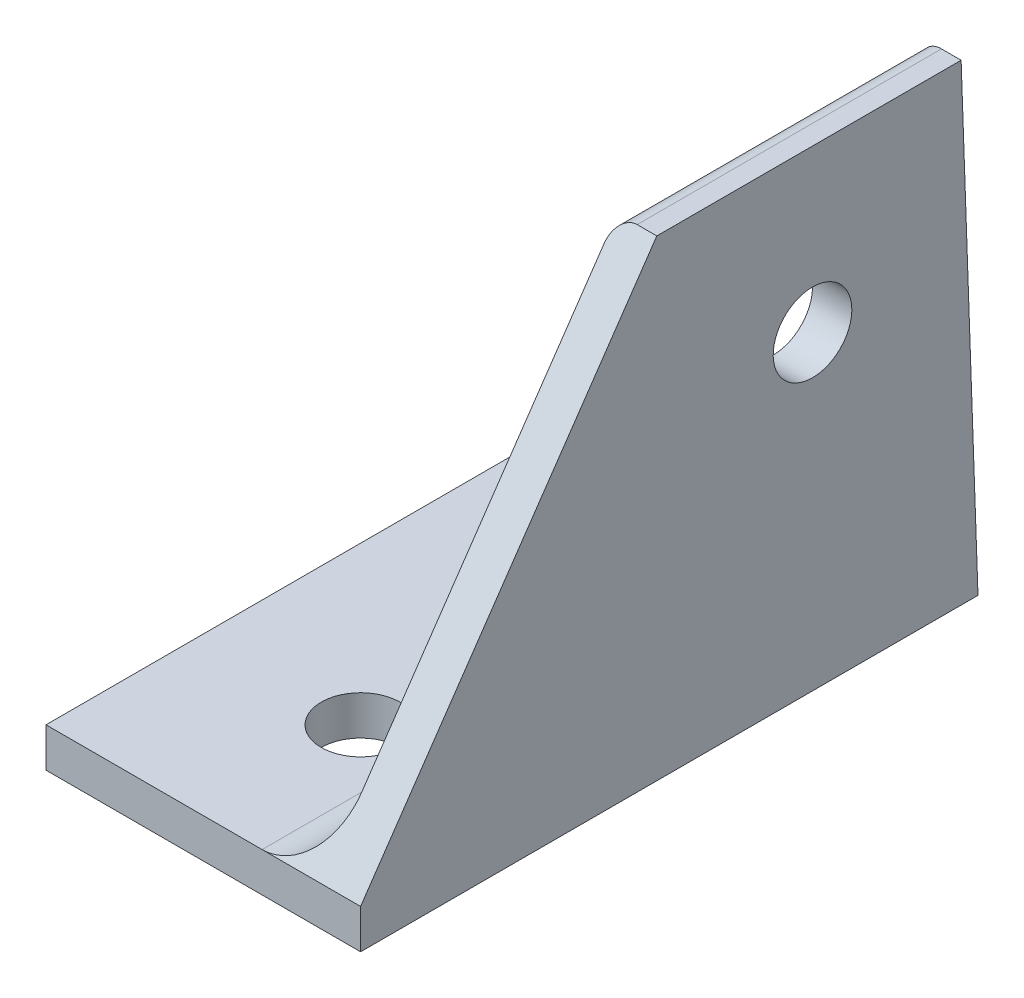
ISO-10303-21;
HEADER;
FILE_DESCRIPTION(('STEP AP214'),'2;1');
FILE_NAME('part.step','',(''),(''),'','','');
FILE_SCHEMA(('AUTOMOTIVE_DESIGN { 1 0 10303 214 1 1 1 1 }'));
ENDSEC;
DATA;
#1=APPLICATION_CONTEXT('core data for automotive mechanical design processes');
#2=APPLICATION_PROTOCOL_DEFINITION('international standard','automotive_design',2000,#1);
#3=PRODUCT_CONTEXT('',#1,'mechanical');
#4=PRODUCT('Part','Part','',(#3));
#5=PRODUCT_RELATED_PRODUCT_CATEGORY('part','',(#4));
#6=PRODUCT_DEFINITION_FORMATION('','',#4);
#7=PRODUCT_DEFINITION_CONTEXT('part definition',#1,'design');
#8=PRODUCT_DEFINITION('design','',#6,#7);
#9=PRODUCT_DEFINITION_SHAPE('','',#8);
#10=(LENGTH_UNIT() NAMED_UNIT(*) SI_UNIT(.MILLI.,.METRE.));
#11=(NAMED_UNIT(*) PLANE_ANGLE_UNIT() SI_UNIT($,.RADIAN.));
#12=(NAMED_UNIT(*) SI_UNIT($,.STERADIAN.) SOLID_ANGLE_UNIT());
#13=UNCERTAINTY_MEASURE_WITH_UNIT(LENGTH_MEASURE(1.E-05),#10,'distance_accuracy_value','');
#14=(GEOMETRIC_REPRESENTATION_CONTEXT(3) GLOBAL_UNCERTAINTY_ASSIGNED_CONTEXT((#13)) GLOBAL_UNIT_ASSIGNED_CONTEXT((#10,
#11,#12)) REPRESENTATION_CONTEXT('',''));
#15=CARTESIAN_POINT('',(0.,0.,0.));
#16=DIRECTION('',(0.,0.,1.));
#17=DIRECTION('',(1.,0.,0.));
#18=AXIS2_PLACEMENT_3D('',#15,#16,#17);
#19=CARTESIAN_POINT('',(11.0998,-11.0998,25.4));
#20=DIRECTION('',(0.,0.,-1.));
#21=DIRECTION('',(-1.,0.,0.));
#22=AXIS2_PLACEMENT_3D('',#19,#20,#21);
#23=CYLINDRICAL_SURFACE('',#22,4.7752);
#24=CARTESIAN_POINT('',(6.88003507763762,-13.335,19.0278402963787));
#25=CARTESIAN_POINT('',(6.93737895741714,-13.4432936537749,19.0230283941298));
#26=CARTESIAN_POINT('',(6.99890621721566,-13.5493376227906,19.0170982822242));
#27=CARTESIAN_POINT('',(7.12983744125809,-13.7562802038008,19.0022793403058));
#28=CARTESIAN_POINT('',(7.19924425014794,-13.8571769383852,18.9933894395079));
#29=CARTESIAN_POINT('',(7.34554709207386,-14.0532938068013,18.9719097961796));
#30=CARTESIAN_POINT('',(7.42245769736283,-14.1485022921912,18.9593127548436));
#31=CARTESIAN_POINT('',(7.58297322725268,-14.3323453128781,18.9296819308128));
#32=CARTESIAN_POINT('',(7.66657723631092,-14.4209807440719,18.9126487541894));
#33=CARTESIAN_POINT('',(7.83998865270394,-14.5913598732798,18.873358995676));
#34=CARTESIAN_POINT('',(7.92981653614712,-14.6730786471434,18.8510845327148));
#35=CARTESIAN_POINT('',(8.11445178806393,-14.8287150041757,18.8006855182258));
#36=CARTESIAN_POINT('',(8.20925890417531,-14.9026329821414,18.7725612629693));
#37=CARTESIAN_POINT('',(8.40256289987545,-15.042086451942,18.709973662455));
#38=CARTESIAN_POINT('',(8.50105214072499,-15.1076381743255,18.6755229174762));
#39=CARTESIAN_POINT('',(8.70068174850552,-15.2302340316935,18.5998462133095));
#40=CARTESIAN_POINT('',(8.80182194734073,-15.2872787045781,18.5586206828377));
#41=CARTESIAN_POINT('',(8.99980063606292,-15.3898194627662,18.4716624273476));
#42=CARTESIAN_POINT('',(9.09656476652935,-15.4357819566276,18.426308887548));
#43=CARTESIAN_POINT('',(9.29027778267202,-15.5201312392108,18.3292986180683));
#44=CARTESIAN_POINT('',(9.38722671860882,-15.5585155336942,18.2776398221408));
#45=CARTESIAN_POINT('',(9.58027851767723,-15.6279473005465,18.1681004479828));
#46=CARTESIAN_POINT('',(9.67638103997989,-15.6589919367842,18.1102174771851));
#47=CARTESIAN_POINT('',(9.86678909468268,-15.7141308617451,17.9884283489238));
#48=CARTESIAN_POINT('',(9.96109391344437,-15.7382224418358,17.9245198569856));
#49=CARTESIAN_POINT('',(10.1487961326925,-15.7803504475946,17.7897195234165));
#50=CARTESIAN_POINT('',(10.2421426384884,-15.7982637349872,17.7187184661595));
#51=CARTESIAN_POINT('',(10.4253414921243,-15.8280409453218,17.5711347504197));
#52=CARTESIAN_POINT('',(10.5151925813661,-15.8399027075717,17.4945501094617));
#53=CARTESIAN_POINT('',(10.778494974809,-15.86744235049,17.2570468848128));
#54=CARTESIAN_POINT('',(10.9458190185711,-15.8751002049823,17.0882904782411));
#55=CARTESIAN_POINT('',(11.2870056474542,-15.8748803579689,16.7031874627303));
#56=CARTESIAN_POINT('',(11.4571849483907,-15.8641550432969,16.4836197336304));
#57=CARTESIAN_POINT('',(11.7672177355786,-15.8307027037329,16.0246112869378));
#58=CARTESIAN_POINT('',(11.907038782785,-15.80796292908,15.7851496858821));
#59=CARTESIAN_POINT('',(12.1057440435861,-15.7684684233756,15.3874232442176));
#60=CARTESIAN_POINT('',(12.1748867796633,-15.7528549140429,15.2340636061475));
#61=CARTESIAN_POINT('',(12.3008208388086,-15.72195259153,14.9222700743469));
#62=CARTESIAN_POINT('',(12.3576107110047,-15.7066638166806,14.7638355870682));
#63=CARTESIAN_POINT('',(12.45846602439,-15.677934259298,14.4428275899199));
#64=CARTESIAN_POINT('',(12.5025331267342,-15.6644932356323,14.2802546234121));
#65=CARTESIAN_POINT('',(12.5776485978355,-15.6407308005637,13.9519001157883));
#66=CARTESIAN_POINT('',(12.6086971936208,-15.6304093347602,13.7861186306781));
#67=CARTESIAN_POINT('',(12.6588788319042,-15.6133968873523,13.4431216698199));
#68=CARTESIAN_POINT('',(12.6772538368582,-15.6069395282463,13.2657827497577));
#69=CARTESIAN_POINT('',(12.6990255278005,-15.5992607396308,12.9100661202933));
#70=CARTESIAN_POINT('',(12.7024216490365,-15.5980395075403,12.7316883719778));
#71=CARTESIAN_POINT('',(12.6941988061312,-15.6009604929825,12.3753457295043));
#72=CARTESIAN_POINT('',(12.6825815780144,-15.6051020904002,12.197380789996));
#73=CARTESIAN_POINT('',(12.6444571061267,-15.6183145879786,11.8432465351295));
#74=CARTESIAN_POINT('',(12.6179501564463,-15.6273853907812,11.6670771843761));
#75=CARTESIAN_POINT('',(12.5520022259341,-15.6489514060258,11.3266047591151));
#76=CARTESIAN_POINT('',(12.5132768840782,-15.6612519788388,11.1621497842813));
#77=CARTESIAN_POINT('',(12.422918499426,-15.688276210361,10.8370381749408));
#78=CARTESIAN_POINT('',(12.3712857689001,-15.7029998104466,10.6763814486454));
#79=CARTESIAN_POINT('',(12.2553661417433,-15.7334589186654,10.3595637563274));
#80=CARTESIAN_POINT('',(12.1910629005624,-15.7491957159493,10.2034088990013));
#81=CARTESIAN_POINT('',(12.0501999604703,-15.780021260393,9.8966617078283));
#82=CARTESIAN_POINT('',(11.9736402091966,-15.795110004784,9.74606939774928));
#83=CARTESIAN_POINT('',(11.8037079261664,-15.8236659721182,9.44245251004817));
#84=CARTESIAN_POINT('',(11.7096032384129,-15.8369820316139,9.28982209185568));
#85=CARTESIAN_POINT('',(11.5086058899827,-15.8585421257696,8.99278535680496));
#86=CARTESIAN_POINT('',(11.4017113133255,-15.8667853993652,8.84838027693247));
#87=CARTESIAN_POINT('',(11.1761655108162,-15.8757201782712,8.56929239293395));
#88=CARTESIAN_POINT('',(11.0575402384892,-15.8764279941164,8.43458921743089));
#89=CARTESIAN_POINT('',(10.8094916009076,-15.8677798350891,8.17589843539221));
#90=CARTESIAN_POINT('',(10.6800739319812,-15.8584291385674,8.05190524550594));
#91=CARTESIAN_POINT('',(10.4536142888575,-15.831993396274,7.85252024581605));
#92=CARTESIAN_POINT('',(10.3589536095084,-15.8181991461145,7.77396637345322));
#93=CARTESIAN_POINT('',(10.1660156534721,-15.7838341591607,7.6230412722257));
#94=CARTESIAN_POINT('',(10.0677393426206,-15.7632652205652,7.55066840915408));
#95=CARTESIAN_POINT('',(9.86851322130231,-15.7146642923725,7.41253855675464));
#96=CARTESIAN_POINT('',(9.76756528318763,-15.6866374109871,7.3467770813693));
#97=CARTESIAN_POINT('',(9.56397715644739,-15.6225391977995,7.22212671965986));
#98=CARTESIAN_POINT('',(9.46133692579619,-15.5864676659405,7.16323800430515));
#99=CARTESIAN_POINT('',(9.25506944179915,-15.5056855403305,7.05227028972765));
#100=CARTESIAN_POINT('',(9.15143981685686,-15.4609351719456,7.00022456851382));
#101=CARTESIAN_POINT('',(8.94496485557415,-15.3626968470269,6.90330568586952));
#102=CARTESIAN_POINT('',(8.84211952547378,-15.3092088210501,6.85843258144951));
#103=CARTESIAN_POINT('',(8.63851005417899,-15.1934904998434,6.7757023494537));
#104=CARTESIAN_POINT('',(8.53774643019223,-15.1312580612943,6.73784694725985));
#105=CARTESIAN_POINT('',(8.33961151394861,-14.9982776042241,6.66883488769724));
#106=CARTESIAN_POINT('',(8.24224001896745,-14.9275300957199,6.63767782943692));
#107=CARTESIAN_POINT('',(8.05893076474308,-14.783311367469,6.58358581226963));
#108=CARTESIAN_POINT('',(7.97267481700726,-14.7104043360672,6.56021999729303));
#109=CARTESIAN_POINT('',(7.80493236327114,-14.5580108675913,6.51832172671615));
#110=CARTESIAN_POINT('',(7.72344599085452,-14.47852424639,6.49978940643958));
#111=CARTESIAN_POINT('',(7.56600515418452,-14.3134943509764,6.46699931222849));
#112=CARTESIAN_POINT('',(7.49004862534852,-14.2279533609488,6.45273993671775));
#113=CARTESIAN_POINT('',(7.34426542788632,-14.051342608642,6.42788693505859));
#114=CARTESIAN_POINT('',(7.27443699308412,-13.9602744522302,6.41729225010439));
#115=CARTESIAN_POINT('',(7.14756044213684,-13.7818116287571,6.39999094171637));
#116=CARTESIAN_POINT('',(7.08992762533942,-13.6948572240645,6.39301519786515));
#117=CARTESIAN_POINT('',(6.98054648548801,-13.517471813578,6.38114618411958));
#118=CARTESIAN_POINT('',(6.92878448831154,-13.4270495715068,6.37624799910068));
#119=CARTESIAN_POINT('',(6.88003507763762,-13.335,6.37215970362133));
#120=B_SPLINE_CURVE_WITH_KNOTS('',3,(#24,#25,#26,#27,#28,#29,#30,#31,#32,#33,#34,#35,#36,#37,
#38,#39,#40,#41,#42,#43,#44,#45,#46,#47,#48,#49,#50,#51,#52,#53,#54,#55,#56,#57,#58,#59,#60,#61,
#62,#63,#64,#65,#66,#67,#68,#69,#70,#71,#72,#73,#74,#75,#76,#77,#78,#79,#80,#81,#82,#83,#84,#85,
#86,#87,#88,#89,#90,#91,#92,#93,#94,#95,#96,#97,#98,#99,#100,#101,#102,#103,#104,#105,#106,#107,
#108,#109,#110,#111,#112,#113,#114,#115,#116,#117,#118,#119),.UNSPECIFIED.,.F.,.F.,(4,2,2,2,2,2,
2,2,2,2,2,2,2,2,2,2,2,2,2,2,2,2,2,2,2,2,2,2,2,2,2,2,2,2,2,2,2,2,2,2,2,2,2,2,2,2,2,4),(0.,
0.367825630230073,0.735784476349647,1.10447268132528,1.47311054196626,1.84302475630723,
2.21292024035921,2.58208685113515,2.95123010962312,3.29980265044694,3.64848972756428,
3.99731132210511,4.34626862073987,4.70182572592775,5.0575096938046,5.76841956955472,
6.59960610665451,7.43167647691122,7.93806241641157,8.44450780000763,8.95088702936324,
9.4572574276675,9.99176720503648,10.5262971349741,11.0607652616452,11.5952228322815,
12.1028659854212,12.6104968582646,13.1187868968199,13.6270791069567,14.1658025653344,
14.7046068280855,15.2422446086811,15.7796003936027,16.1505925509065,16.5214863153724,
16.8921266924182,17.2627762876901,17.6351665009604,18.0075596739706,18.3800442830042,
18.7525065928655,19.0981133844421,19.4437298509599,19.7892166117336,20.1346034706119,
20.4480195551427,20.760689961753),.UNSPECIFIED.);
#121=CARTESIAN_POINT('',(11.0998,-15.875,16.9144869153908));
#122=VERTEX_POINT('',#121);
#123=CARTESIAN_POINT('',(11.0998,-15.875,8.48551308460923));
#124=VERTEX_POINT('',#123);
#125=EDGE_CURVE('E130',#122,#124,#120,.T.);
#126=ORIENTED_EDGE('',*,*,#125,.F.);
#127=DIRECTION('',(0.,0.,-1.));
#128=VECTOR('',#127,1.);
#129=CARTESIAN_POINT('',(11.0998,-15.875,25.4));
#130=LINE('',#129,#128);
#131=CARTESIAN_POINT('',(11.0998,-15.875,25.4));
#132=VERTEX_POINT('',#131);
#133=EDGE_CURVE('E134',#132,#122,#130,.T.);
#134=ORIENTED_EDGE('',*,*,#133,.F.);
#135=CARTESIAN_POINT('',(11.0998,-11.0998,22.1300519637949));
#136=DIRECTION('',(0.,0.565002335416409,0.825089304847665));
#137=DIRECTION('',(0.,0.825089304847665,-0.565002335416409));
#138=AXIS2_PLACEMENT_3D('',#135,#136,#137);
#139=ELLIPSE('',#138,5.78749472565474,4.7752);
#140=CARTESIAN_POINT('',(15.875,-11.0998,22.1300519637949));
#141=VERTEX_POINT('',#140);
#142=EDGE_CURVE('E181',#141,#132,#139,.F.);
#143=ORIENTED_EDGE('',*,*,#142,.F.);
#144=DIRECTION('',(0.,0.,-1.));
#145=VECTOR('',#144,1.);
#146=CARTESIAN_POINT('',(15.875,-11.0998,25.4));
#147=LINE('',#146,#145);
#148=CARTESIAN_POINT('',(15.875,-11.0998,-24.1652486172113));
#149=VERTEX_POINT('',#148);
#150=EDGE_CURVE('E136',#141,#149,#147,.T.);
#151=ORIENTED_EDGE('',*,*,#150,.T.);
#152=CARTESIAN_POINT('',(11.0998,-11.0998,-24.1652486172113));
#153=DIRECTION('',(0.,0.0357334750353036,-0.999361355447518));
#154=DIRECTION('',(0.,-0.999361355447518,-0.0357334750353036));
#155=AXIS2_PLACEMENT_3D('',#152,#153,#154);
#156=ELLIPSE('',#155,4.77825160435751,4.7752);
#157=CARTESIAN_POINT('',(11.0998,-15.875,-24.335992151628));
#158=VERTEX_POINT('',#157);
#159=EDGE_CURVE('E187',#158,#149,#156,.F.);
#160=ORIENTED_EDGE('',*,*,#159,.F.);
#161=CARTESIAN_POINT('',(11.0998,-15.875,-16.9144869153908));
#162=VERTEX_POINT('',#161);
#163=EDGE_CURVE('E129',#162,#158,#130,.T.);
#164=ORIENTED_EDGE('',*,*,#163,.F.);
#165=CARTESIAN_POINT('',(6.88003507763762,-13.335,-6.37215970362133));
#166=CARTESIAN_POINT('',(6.93737895741714,-13.4432936537749,-6.37697160587021));
#167=CARTESIAN_POINT('',(6.99890621721566,-13.5493376227906,-6.38290171777577));
#168=CARTESIAN_POINT('',(7.12983744125809,-13.7562802038008,-6.39772065969424));
#169=CARTESIAN_POINT('',(7.19924425014793,-13.8571769383852,-6.40661056049213));
#170=CARTESIAN_POINT('',(7.34554709207386,-14.0532938068013,-6.42809020382043));
#171=CARTESIAN_POINT('',(7.42245769736283,-14.1485022921912,-6.44068724515636));
#172=CARTESIAN_POINT('',(7.58297322725268,-14.3323453128781,-6.47031806918718));
#173=CARTESIAN_POINT('',(7.66657723631091,-14.4209807440719,-6.48735124581064));
#174=CARTESIAN_POINT('',(7.83998865270394,-14.5913598732798,-6.52664100432397));
#175=CARTESIAN_POINT('',(7.92981653614712,-14.6730786471434,-6.54891546728517));
#176=CARTESIAN_POINT('',(8.11445178806393,-14.8287150041757,-6.59931448177421));
#177=CARTESIAN_POINT('',(8.20925890417531,-14.9026329821414,-6.62743873703072));
#178=CARTESIAN_POINT('',(8.40256289987545,-15.042086451942,-6.69002633754502));
#179=CARTESIAN_POINT('',(8.50105214072499,-15.1076381743255,-6.72447708252384));
#180=CARTESIAN_POINT('',(8.70068174850552,-15.2302340316935,-6.80015378669049));
#181=CARTESIAN_POINT('',(8.80182194734074,-15.2872787045781,-6.8413793171623));
#182=CARTESIAN_POINT('',(8.99980063606292,-15.3898194627662,-6.92833757265237));
#183=CARTESIAN_POINT('',(9.09656476652934,-15.4357819566276,-6.973691112452));
#184=CARTESIAN_POINT('',(9.29027778267202,-15.5201312392108,-7.0707013819317));
#185=CARTESIAN_POINT('',(9.38722671860882,-15.5585155336942,-7.12236017785922));
#186=CARTESIAN_POINT('',(9.58027851767723,-15.6279473005465,-7.23189955201716));
#187=CARTESIAN_POINT('',(9.67638103997989,-15.6589919367842,-7.28978252281494));
#188=CARTESIAN_POINT('',(9.86678909468268,-15.7141308617451,-7.41157165107616));
#189=CARTESIAN_POINT('',(9.96109391344437,-15.7382224418358,-7.47548014301443));
#190=CARTESIAN_POINT('',(10.1487961326925,-15.7803504475946,-7.61028047658352));
#191=CARTESIAN_POINT('',(10.2421426384884,-15.7982637349872,-7.68128153384045));
#192=CARTESIAN_POINT('',(10.4253414921243,-15.8280409453218,-7.82886524958031));
#193=CARTESIAN_POINT('',(10.5151925813661,-15.8399027075716,-7.90544989053833));
#194=CARTESIAN_POINT('',(10.778494974809,-15.86744235049,-8.14295311518722));
#195=CARTESIAN_POINT('',(10.9458190185711,-15.8751002049823,-8.31170952175891));
#196=CARTESIAN_POINT('',(11.2870056474542,-15.8748803579689,-8.69681253726973));
#197=CARTESIAN_POINT('',(11.4571849483907,-15.8641550432969,-8.91638026636961));
#198=CARTESIAN_POINT('',(11.7672177355786,-15.8307027037329,-9.3753887130622));
#199=CARTESIAN_POINT('',(11.907038782785,-15.80796292908,-9.61485031411785));
#200=CARTESIAN_POINT('',(12.1057440435861,-15.7684684233756,-10.0125767557824));
#201=CARTESIAN_POINT('',(12.1748867796633,-15.7528549140429,-10.1659363938524));
#202=CARTESIAN_POINT('',(12.3008208388086,-15.72195259153,-10.4777299256531));
#203=CARTESIAN_POINT('',(12.3576107110047,-15.7066638166806,-10.6361644129318));
#204=CARTESIAN_POINT('',(12.45846602439,-15.677934259298,-10.95717241008));
#205=CARTESIAN_POINT('',(12.5025331267342,-15.6644932356323,-11.1197453765879));
#206=CARTESIAN_POINT('',(12.5776485978355,-15.6407308005637,-11.4480998842117));
#207=CARTESIAN_POINT('',(12.6086971936208,-15.6304093347602,-11.6138813693219));
#208=CARTESIAN_POINT('',(12.6588788319042,-15.6133968873523,-11.9568783301801));
#209=CARTESIAN_POINT('',(12.6772538368582,-15.6069395282463,-12.1342172502423));
#210=CARTESIAN_POINT('',(12.6990255278005,-15.5992607396308,-12.4899338797067));
#211=CARTESIAN_POINT('',(12.7024216490365,-15.5980395075403,-12.6683116280222));
#212=CARTESIAN_POINT('',(12.6941988061312,-15.6009604929825,-13.0246542704957));
#213=CARTESIAN_POINT('',(12.6825815780144,-15.6051020904002,-13.202619210004));
#214=CARTESIAN_POINT('',(12.6444571061267,-15.6183145879786,-13.5567534648705));
#215=CARTESIAN_POINT('',(12.6179501564463,-15.6273853907812,-13.7329228156239));
#216=CARTESIAN_POINT('',(12.5520022259341,-15.6489514060258,-14.0733952408849));
#217=CARTESIAN_POINT('',(12.5132768840782,-15.6612519788388,-14.2378502157187));
#218=CARTESIAN_POINT('',(12.422918499426,-15.688276210361,-14.5629618250592));
#219=CARTESIAN_POINT('',(12.3712857689001,-15.7029998104466,-14.7236185513546));
#220=CARTESIAN_POINT('',(12.2553661417433,-15.7334589186654,-15.0404362436726));
#221=CARTESIAN_POINT('',(12.1910629005624,-15.7491957159493,-15.1965911009987));
#222=CARTESIAN_POINT('',(12.0501999604703,-15.780021260393,-15.5033382921717));
#223=CARTESIAN_POINT('',(11.9736402091966,-15.795110004784,-15.6539306022507));
#224=CARTESIAN_POINT('',(11.8037079261664,-15.8236659721182,-15.9575474899518));
#225=CARTESIAN_POINT('',(11.7096032384129,-15.8369820316139,-16.1101779081443));
#226=CARTESIAN_POINT('',(11.5086058899827,-15.8585421257696,-16.407214643195));
#227=CARTESIAN_POINT('',(11.4017113133255,-15.8667853993652,-16.5516197230675));
#228=CARTESIAN_POINT('',(11.1761655108162,-15.8757201782712,-16.830707607066));
#229=CARTESIAN_POINT('',(11.0575402384892,-15.8764279941164,-16.9654107825691));
#230=CARTESIAN_POINT('',(10.8094916009077,-15.8677798350891,-17.2241015646078));
#231=CARTESIAN_POINT('',(10.6800739319812,-15.8584291385674,-17.3480947544941));
#232=CARTESIAN_POINT('',(10.4536142888575,-15.831993396274,-17.5474797541839));
#233=CARTESIAN_POINT('',(10.3589536095084,-15.8181991461145,-17.6260336265468));
#234=CARTESIAN_POINT('',(10.1660156534721,-15.7838341591607,-17.7769587277743));
#235=CARTESIAN_POINT('',(10.0677393426206,-15.7632652205652,-17.8493315908459));
#236=CARTESIAN_POINT('',(9.86851322130232,-15.7146642923725,-17.9874614432454));
#237=CARTESIAN_POINT('',(9.76756528318763,-15.6866374109871,-18.0532229186307));
#238=CARTESIAN_POINT('',(9.5639771564474,-15.6225391977995,-18.1778732803401));
#239=CARTESIAN_POINT('',(9.4613369257962,-15.5864676659405,-18.2367619956949));
#240=CARTESIAN_POINT('',(9.25506944179916,-15.5056855403305,-18.3477297102723));
#241=CARTESIAN_POINT('',(9.15143981685686,-15.4609351719456,-18.3997754314862));
#242=CARTESIAN_POINT('',(8.94496485557415,-15.3626968470269,-18.4966943141305));
#243=CARTESIAN_POINT('',(8.84211952547378,-15.3092088210501,-18.5415674185505));
#244=CARTESIAN_POINT('',(8.63851005417899,-15.1934904998434,-18.6242976505463));
#245=CARTESIAN_POINT('',(8.53774643019224,-15.1312580612943,-18.6621530527401));
#246=CARTESIAN_POINT('',(8.33961151394861,-14.9982776042241,-18.7311651123028));
#247=CARTESIAN_POINT('',(8.24224001896746,-14.9275300957199,-18.7623221705631));
#248=CARTESIAN_POINT('',(8.05893076474308,-14.783311367469,-18.8164141877304));
#249=CARTESIAN_POINT('',(7.97267481700726,-14.7104043360672,-18.839780002707));
#250=CARTESIAN_POINT('',(7.80493236327114,-14.5580108675913,-18.8816782732838));
#251=CARTESIAN_POINT('',(7.72344599085452,-14.47852424639,-18.9002105935604));
#252=CARTESIAN_POINT('',(7.56600515418452,-14.3134943509764,-18.9330006877715));
#253=CARTESIAN_POINT('',(7.49004862534852,-14.2279533609488,-18.9472600632823));
#254=CARTESIAN_POINT('',(7.34426542788632,-14.051342608642,-18.9721130649414));
#255=CARTESIAN_POINT('',(7.27443699308412,-13.9602744522302,-18.9827077498956));
#256=CARTESIAN_POINT('',(7.14756044213684,-13.7818116287571,-19.0000090582836));
#257=CARTESIAN_POINT('',(7.08992762533942,-13.6948572240645,-19.0069848021349));
#258=CARTESIAN_POINT('',(6.98054648548801,-13.517471813578,-19.0188538158804));
#259=CARTESIAN_POINT('',(6.92878448831154,-13.4270495715068,-19.0237520008993));
#260=CARTESIAN_POINT('',(6.88003507763762,-13.335,-19.0278402963787));
#261=B_SPLINE_CURVE_WITH_KNOTS('',3,(#165,#166,#167,#168,#169,#170,#171,#172,#173,#174,#175,
#176,#177,#178,#179,#180,#181,#182,#183,#184,#185,#186,#187,#188,#189,#190,#191,#192,#193,#194,
#195,#196,#197,#198,#199,#200,#201,#202,#203,#204,#205,#206,#207,#208,#209,#210,#211,#212,#213,
#214,#215,#216,#217,#218,#219,#220,#221,#222,#223,#224,#225,#226,#227,#228,#229,#230,#231,#232,
#233,#234,#235,#236,#237,#238,#239,#240,#241,#242,#243,#244,#245,#246,#247,#248,#249,#250,#251,
#252,#253,#254,#255,#256,#257,#258,#259,#260),.UNSPECIFIED.,.F.,.F.,(4,2,2,2,2,2,2,2,2,2,2,2,2,
2,2,2,2,2,2,2,2,2,2,2,2,2,2,2,2,2,2,2,2,2,2,2,2,2,2,2,2,2,2,2,2,2,2,4),(0.,0.367825630230072,
0.735784476349645,1.10447268132528,1.47311054196626,1.84302475630723,2.21292024035922,
2.58208685113516,2.95123010962312,3.29980265044693,3.64848972756428,3.99731132210511,
4.34626862073987,4.70182572592775,5.0575096938046,5.76841956955473,6.59960610665451,
7.43167647691122,7.93806241641157,8.44450780000762,8.95088702936323,9.4572574276675,
9.99176720503649,10.5262971349741,11.0607652616452,11.5952228322815,12.1028659854212,
12.6104968582646,13.1187868968199,13.6270791069567,14.1658025653344,14.7046068280855,
15.2422446086811,15.7796003936027,16.1505925509065,16.5214863153724,16.8921266924182,
17.2627762876901,17.6351665009604,18.0075596739706,18.3800442830042,18.7525065928655,
19.0981133844421,19.4437298509599,19.7892166117336,20.1346034706119,20.4480195551427,
20.760689961753),.UNSPECIFIED.);
#262=CARTESIAN_POINT('',(11.0998,-15.875,-8.48551308460923));
#263=VERTEX_POINT('',#262);
#264=EDGE_CURVE('E121',#263,#162,#261,.T.);
#265=ORIENTED_EDGE('',*,*,#264,.F.);
#266=EDGE_CURVE('E127',#124,#263,#130,.T.);
#267=ORIENTED_EDGE('',*,*,#266,.F.);
#268=EDGE_LOOP('',(#126,#134,#143,#151,#160,#164,#265,#267));
#269=FACE_BOUND('',#268,.T.);
#270=ADVANCED_FACE('F40',(#269),#23,.F.);
#271=CARTESIAN_POINT('',(-19.05,-19.05,25.4));
#272=DIRECTION('',(0.,1.,0.));
#273=DIRECTION('',(-1.,0.,0.));
#274=AXIS2_PLACEMENT_3D('',#271,#272,#273);
#275=PLANE('',#274);
#276=CARTESIAN_POINT('',(6.35000000000001,-19.05,12.7));
#277=DIRECTION('',(0.,-1.,0.));
#278=DIRECTION('',(1.,0.,0.));
#279=AXIS2_PLACEMENT_3D('',#276,#277,#278);
#280=CIRCLE('',#279,3.175);
#281=CARTESIAN_POINT('',(9.52500000000001,-19.05,12.7));
#282=VERTEX_POINT('',#281);
#283=EDGE_CURVE('E167',#282,#282,#280,.T.);
#284=ORIENTED_EDGE('',*,*,#283,.F.);
#285=EDGE_LOOP('',(#284));
#286=FACE_BOUND('',#285,.T.);
#287=CARTESIAN_POINT('',(6.35000000000001,-19.05,-12.7));
#288=DIRECTION('',(0.,-1.,0.));
#289=DIRECTION('',(1.,0.,0.));
#290=AXIS2_PLACEMENT_3D('',#287,#288,#289);
#291=CIRCLE('',#290,3.175);
#292=CARTESIAN_POINT('',(9.52500000000001,-19.05,-12.7));
#293=VERTEX_POINT('',#292);
#294=EDGE_CURVE('E170',#293,#293,#291,.T.);
#295=ORIENTED_EDGE('',*,*,#294,.F.);
#296=EDGE_LOOP('',(#295));
#297=FACE_BOUND('',#296,.T.);
#298=DIRECTION('',(1.,0.,0.));
#299=VECTOR('',#298,1.);
#300=CARTESIAN_POINT('',(-6.34999999999999,-19.05,-24.4495184378094));
#301=LINE('',#300,#299);
#302=CARTESIAN_POINT('',(-6.34999999999999,-19.05,-24.4495184378094));
#303=VERTEX_POINT('',#302);
#304=CARTESIAN_POINT('',(19.05,-19.05,-24.4495184378094));
#305=VERTEX_POINT('',#304);
#306=EDGE_CURVE('E199',#303,#305,#301,.T.);
#307=ORIENTED_EDGE('',*,*,#306,.T.);
#308=DIRECTION('',(0.,0.,-1.));
#309=VECTOR('',#308,1.);
#310=CARTESIAN_POINT('',(19.05,-19.05,25.4));
#311=LINE('',#310,#309);
#312=CARTESIAN_POINT('',(19.05,-19.05,25.4));
#313=VERTEX_POINT('',#312);
#314=EDGE_CURVE('E12',#313,#305,#311,.T.);
#315=ORIENTED_EDGE('',*,*,#314,.F.);
#316=DIRECTION('',(1.,0.,0.));
#317=VECTOR('',#316,1.);
#318=CARTESIAN_POINT('',(-19.05,-19.05,25.4));
#319=LINE('',#318,#317);
#320=CARTESIAN_POINT('',(-6.35,-19.05,25.4));
#321=VERTEX_POINT('',#320);
#322=EDGE_CURVE('E156',#321,#313,#319,.T.);
#323=ORIENTED_EDGE('',*,*,#322,.F.);
#324=DIRECTION('',(0.,0.,1.));
#325=VECTOR('',#324,1.);
#326=CARTESIAN_POINT('',(-6.35,-19.05,25.4));
#327=LINE('',#326,#325);
#328=EDGE_CURVE('E171',#303,#321,#327,.T.);
#329=ORIENTED_EDGE('',*,*,#328,.F.);
#330=EDGE_LOOP('',(#307,#315,#323,#329));
#331=FACE_BOUND('',#330,.T.);
#332=ADVANCED_FACE('F42',(#286,#297,#331),#275,.F.);
#333=CARTESIAN_POINT('',(19.05,-19.05,25.4));
#334=DIRECTION('',(-1.,0.,0.));
#335=DIRECTION('',(0.,-1.,0.));
#336=AXIS2_PLACEMENT_3D('',#333,#334,#335);
#337=PLANE('',#336);
#338=CARTESIAN_POINT('',(19.05,6.02190472929892,-11.0886340423407));
#339=DIRECTION('',(1.,0.,0.));
#340=DIRECTION('',(0.,1.,0.));
#341=AXIS2_PLACEMENT_3D('',#338,#339,#340);
#342=CIRCLE('',#341,3.175);
#343=CARTESIAN_POINT('',(19.05,9.19690472929893,-11.0886340423407));
#344=VERTEX_POINT('',#343);
#345=EDGE_CURVE('E210',#344,#344,#342,.T.);
#346=ORIENTED_EDGE('',*,*,#345,.F.);
#347=EDGE_LOOP('',(#346));
#348=FACE_BOUND('',#347,.T.);
#349=DIRECTION('',(0.,0.999361355447518,0.0357334750353036));
#350=VECTOR('',#349,1.);
#351=CARTESIAN_POINT('',(19.05,19.05,-23.0872030036335));
#352=LINE('',#351,#350);
#353=CARTESIAN_POINT('',(19.05,19.05,-23.0872030036335));
#354=VERTEX_POINT('',#353);
#355=EDGE_CURVE('E203',#305,#354,#352,.T.);
#356=ORIENTED_EDGE('',*,*,#355,.T.);
#357=DIRECTION('',(0.,0.,-1.));
#358=VECTOR('',#357,1.);
#359=CARTESIAN_POINT('',(19.05,19.05,25.4));
#360=LINE('',#359,#358);
#361=CARTESIAN_POINT('',(19.05,19.05,1.4841566500958));
#362=VERTEX_POINT('',#361);
#363=EDGE_CURVE('E49',#362,#354,#360,.T.);
#364=ORIENTED_EDGE('',*,*,#363,.F.);
#365=DIRECTION('',(0.,-0.825089304847665,0.565002335416409));
#366=VECTOR('',#365,1.);
#367=CARTESIAN_POINT('',(19.05,19.05,1.48415665009581));
#368=LINE('',#367,#366);
#369=CARTESIAN_POINT('',(19.05,-15.875,25.4));
#370=VERTEX_POINT('',#369);
#371=EDGE_CURVE('E206',#362,#370,#368,.T.);
#372=ORIENTED_EDGE('',*,*,#371,.T.);
#373=DIRECTION('',(0.,1.,0.));
#374=VECTOR('',#373,1.);
#375=CARTESIAN_POINT('',(19.05,-19.05,25.4));
#376=LINE('',#375,#374);
#377=EDGE_CURVE('E158',#313,#370,#376,.T.);
#378=ORIENTED_EDGE('',*,*,#377,.F.);
#379=ORIENTED_EDGE('',*,*,#314,.T.);
#380=EDGE_LOOP('',(#356,#364,#372,#378,#379));
#381=FACE_BOUND('',#380,.T.);
#382=ADVANCED_FACE('F271',(#348,#381),#337,.F.);
#383=CARTESIAN_POINT('',(17.4625,19.05,25.4));
#384=DIRECTION('',(0.,-1.,0.));
#385=DIRECTION('',(1.,0.,0.));
#386=AXIS2_PLACEMENT_3D('',#383,#384,#385);
#387=PLANE('',#386);
#388=DIRECTION('',(1.,0.,0.));
#389=VECTOR('',#388,1.);
#390=CARTESIAN_POINT('',(-6.35,19.05,-23.0872030036335));
#391=LINE('',#390,#389);
#392=CARTESIAN_POINT('',(17.4625,19.05,-23.0872030036335));
#393=VERTEX_POINT('',#392);
#394=EDGE_CURVE('E192',#393,#354,#391,.T.);
#395=ORIENTED_EDGE('',*,*,#394,.F.);
#396=DIRECTION('',(0.,0.,-1.));
#397=VECTOR('',#396,1.);
#398=CARTESIAN_POINT('',(17.4625,19.05,25.4));
#399=LINE('',#398,#397);
#400=CARTESIAN_POINT('',(17.4625,19.05,1.48415665009581));
#401=VERTEX_POINT('',#400);
#402=EDGE_CURVE('E146',#401,#393,#399,.T.);
#403=ORIENTED_EDGE('',*,*,#402,.F.);
#404=DIRECTION('',(1.,0.,0.));
#405=VECTOR('',#404,1.);
#406=CARTESIAN_POINT('',(-6.35,19.05,1.48415665009581));
#407=LINE('',#406,#405);
#408=EDGE_CURVE('E193',#401,#362,#407,.T.);
#409=ORIENTED_EDGE('',*,*,#408,.T.);
#410=ORIENTED_EDGE('',*,*,#363,.T.);
#411=EDGE_LOOP('',(#395,#403,#409,#410));
#412=FACE_BOUND('',#411,.T.);
#413=ADVANCED_FACE('F276',(#412),#387,.F.);
#414=CARTESIAN_POINT('',(17.4625,17.4625,25.4));
#415=DIRECTION('',(0.,0.,-1.));
#416=DIRECTION('',(-1.,0.,0.));
#417=AXIS2_PLACEMENT_3D('',#414,#415,#416);
#418=CYLINDRICAL_SURFACE('',#417,1.5875);
#419=CARTESIAN_POINT('',(17.4625,17.4625,-23.1439661467242));
#420=DIRECTION('',(0.,0.0357334750353036,-0.999361355447518));
#421=DIRECTION('',(0.,-0.999361355447518,-0.0357334750353036));
#422=AXIS2_PLACEMENT_3D('',#419,#420,#421);
#423=ELLIPSE('',#422,1.58851449612949,1.5875);
#424=CARTESIAN_POINT('',(15.875,17.4625,-23.1439661467242));
#425=VERTEX_POINT('',#424);
#426=EDGE_CURVE('E183',#425,#393,#423,.T.);
#427=ORIENTED_EDGE('',*,*,#426,.F.);
#428=DIRECTION('',(0.,0.,-1.));
#429=VECTOR('',#428,1.);
#430=CARTESIAN_POINT('',(15.875,17.4625,25.4));
#431=LINE('',#430,#429);
#432=CARTESIAN_POINT('',(15.875,17.4625,2.57124043872782));
#433=VERTEX_POINT('',#432);
#434=EDGE_CURVE('E143',#433,#425,#431,.T.);
#435=ORIENTED_EDGE('',*,*,#434,.F.);
#436=CARTESIAN_POINT('',(17.4625,17.4625,2.57124043872782));
#437=DIRECTION('',(0.,0.565002335416409,0.825089304847665));
#438=DIRECTION('',(0.,0.825089304847665,-0.565002335416409));
#439=AXIS2_PLACEMENT_3D('',#436,#437,#438);
#440=ELLIPSE('',#439,1.92403415081607,1.5875);
#441=EDGE_CURVE('E175',#401,#433,#440,.T.);
#442=ORIENTED_EDGE('',*,*,#441,.F.);
#443=ORIENTED_EDGE('',*,*,#402,.T.);
#444=EDGE_LOOP('',(#427,#435,#442,#443));
#445=FACE_BOUND('',#444,.T.);
#446=ADVANCED_FACE('F265',(#445),#418,.T.);
#447=CARTESIAN_POINT('',(15.875,17.4625,25.4));
#448=DIRECTION('',(1.,0.,0.));
#449=DIRECTION('',(0.,1.,0.));
#450=AXIS2_PLACEMENT_3D('',#447,#448,#449);
#451=PLANE('',#450);
#452=CARTESIAN_POINT('',(15.875,6.02190472929892,-11.0886340423407));
#453=DIRECTION('',(1.,0.,0.));
#454=DIRECTION('',(0.,1.,0.));
#455=AXIS2_PLACEMENT_3D('',#452,#453,#454);
#456=CIRCLE('',#455,3.175);
#457=CARTESIAN_POINT('',(15.875,9.19690472929893,-11.0886340423407));
#458=VERTEX_POINT('',#457);
#459=EDGE_CURVE('E44',#458,#458,#456,.T.);
#460=ORIENTED_EDGE('',*,*,#459,.T.);
#461=EDGE_LOOP('',(#460));
#462=FACE_BOUND('',#461,.T.);
#463=DIRECTION('',(0.,0.999361355447518,0.0357334750353036));
#464=VECTOR('',#463,1.);
#465=CARTESIAN_POINT('',(15.875,19.1960367810928,-23.0819812671285));
#466=LINE('',#465,#464);
#467=EDGE_CURVE('E185',#149,#425,#466,.T.);
#468=ORIENTED_EDGE('',*,*,#467,.F.);
#469=ORIENTED_EDGE('',*,*,#150,.F.);
#470=DIRECTION('',(0.,-0.825089304847665,0.565002335416409));
#471=VECTOR('',#470,1.);
#472=CARTESIAN_POINT('',(15.875,6.82024858397083,9.85881145536489));
#473=LINE('',#472,#471);
#474=EDGE_CURVE('E179',#433,#141,#473,.T.);
#475=ORIENTED_EDGE('',*,*,#474,.F.);
#476=ORIENTED_EDGE('',*,*,#434,.T.);
#477=EDGE_LOOP('',(#468,#469,#475,#476));
#478=FACE_BOUND('',#477,.T.);
#479=ADVANCED_FACE('F261',(#462,#478),#451,.F.);
#480=CARTESIAN_POINT('',(11.0998,-15.875,25.4));
#481=DIRECTION('',(0.,-1.,0.));
#482=DIRECTION('',(1.,0.,0.));
#483=AXIS2_PLACEMENT_3D('',#480,#481,#482);
#484=PLANE('',#483);
#485=ORIENTED_EDGE('',*,*,#133,.T.);
#486=CARTESIAN_POINT('',(6.35000000000001,-15.875,12.7));
#487=DIRECTION('',(0.,1.,0.));
#488=DIRECTION('',(-1.,0.,0.));
#489=AXIS2_PLACEMENT_3D('',#486,#487,#488);
#490=CIRCLE('',#489,6.35);
#491=EDGE_CURVE('E63',#122,#124,#490,.T.);
#492=ORIENTED_EDGE('',*,*,#491,.T.);
#493=ORIENTED_EDGE('',*,*,#266,.T.);
#494=CARTESIAN_POINT('',(6.35000000000001,-15.875,-12.7));
#495=DIRECTION('',(0.,1.,0.));
#496=DIRECTION('',(-1.,0.,0.));
#497=AXIS2_PLACEMENT_3D('',#494,#495,#496);
#498=CIRCLE('',#497,6.35);
#499=EDGE_CURVE('E57',#263,#162,#498,.T.);
#500=ORIENTED_EDGE('',*,*,#499,.T.);
#501=ORIENTED_EDGE('',*,*,#163,.T.);
#502=DIRECTION('',(1.,0.,0.));
#503=VECTOR('',#502,1.);
#504=CARTESIAN_POINT('',(11.0998,-15.875,-24.335992151628));
#505=LINE('',#504,#503);
#506=CARTESIAN_POINT('',(-6.34999999999999,-15.875,-24.335992151628));
#507=VERTEX_POINT('',#506);
#508=EDGE_CURVE('E189',#507,#158,#505,.T.);
#509=ORIENTED_EDGE('',*,*,#508,.F.);
#510=DIRECTION('',(0.,0.,1.));
#511=VECTOR('',#510,1.);
#512=CARTESIAN_POINT('',(-6.35,-15.875,25.4));
#513=LINE('',#512,#511);
#514=CARTESIAN_POINT('',(-6.35,-15.875,25.4));
#515=VERTEX_POINT('',#514);
#516=EDGE_CURVE('E154',#507,#515,#513,.T.);
#517=ORIENTED_EDGE('',*,*,#516,.T.);
#518=DIRECTION('',(-1.,0.,0.));
#519=VECTOR('',#518,1.);
#520=CARTESIAN_POINT('',(11.0998,-15.875,25.4));
#521=LINE('',#520,#519);
#522=EDGE_CURVE('E137',#132,#515,#521,.T.);
#523=ORIENTED_EDGE('',*,*,#522,.F.);
#524=EDGE_LOOP('',(#485,#492,#493,#500,#501,#509,#517,#523));
#525=FACE_BOUND('',#524,.T.);
#526=CARTESIAN_POINT('',(6.35000000000001,-15.875,-12.7));
#527=DIRECTION('',(0.,-1.,0.));
#528=DIRECTION('',(1.,0.,0.));
#529=AXIS2_PLACEMENT_3D('',#526,#527,#528);
#530=CIRCLE('',#529,3.175);
#531=CARTESIAN_POINT('',(9.52500000000001,-15.875,-12.7));
#532=VERTEX_POINT('',#531);
#533=EDGE_CURVE('E153',#532,#532,#530,.T.);
#534=ORIENTED_EDGE('',*,*,#533,.T.);
#535=EDGE_LOOP('',(#534));
#536=FACE_BOUND('',#535,.T.);
#537=CARTESIAN_POINT('',(6.35000000000001,-15.875,12.7));
#538=DIRECTION('',(0.,-1.,0.));
#539=DIRECTION('',(1.,0.,0.));
#540=AXIS2_PLACEMENT_3D('',#537,#538,#539);
#541=CIRCLE('',#540,3.175);
#542=CARTESIAN_POINT('',(9.52500000000001,-15.875,12.7));
#543=VERTEX_POINT('',#542);
#544=EDGE_CURVE('E151',#543,#543,#541,.T.);
#545=ORIENTED_EDGE('',*,*,#544,.T.);
#546=EDGE_LOOP('',(#545));
#547=FACE_BOUND('',#546,.T.);
#548=ADVANCED_FACE('F132',(#525,#536,#547),#484,.F.);
#549=CARTESIAN_POINT('',(17.4625,17.4625,25.4));
#550=DIRECTION('',(0.,0.,-1.));
#551=DIRECTION('',(-1.,0.,0.));
#552=AXIS2_PLACEMENT_3D('',#549,#550,#551);
#553=PLANE('',#552);
#554=DIRECTION('',(1.,0.,0.));
#555=VECTOR('',#554,1.);
#556=CARTESIAN_POINT('',(-6.34999999999999,-15.875,25.4));
#557=LINE('',#556,#555);
#558=EDGE_CURVE('E196',#132,#370,#557,.T.);
#559=ORIENTED_EDGE('',*,*,#558,.F.);
#560=ORIENTED_EDGE('',*,*,#522,.T.);
#561=DIRECTION('',(0.,-1.,0.));
#562=VECTOR('',#561,1.);
#563=CARTESIAN_POINT('',(-6.35,19.05,25.4));
#564=LINE('',#563,#562);
#565=EDGE_CURVE('E173',#515,#321,#564,.T.);
#566=ORIENTED_EDGE('',*,*,#565,.T.);
#567=ORIENTED_EDGE('',*,*,#322,.T.);
#568=ORIENTED_EDGE('',*,*,#377,.T.);
#569=EDGE_LOOP('',(#559,#560,#566,#567,#568));
#570=FACE_BOUND('',#569,.T.);
#571=ADVANCED_FACE('F254',(#570),#553,.F.);
#572=CARTESIAN_POINT('',(-6.35,19.05,25.4));
#573=DIRECTION('',(1.,0.,0.));
#574=DIRECTION('',(0.,0.,-1.));
#575=AXIS2_PLACEMENT_3D('',#572,#573,#574);
#576=PLANE('',#575);
#577=DIRECTION('',(0.,0.999361355447518,0.0357334750353036));
#578=VECTOR('',#577,1.);
#579=CARTESIAN_POINT('',(-6.35,19.05,-23.0872030036335));
#580=LINE('',#579,#578);
#581=EDGE_CURVE('E197',#303,#507,#580,.T.);
#582=ORIENTED_EDGE('',*,*,#581,.F.);
#583=ORIENTED_EDGE('',*,*,#328,.T.);
#584=ORIENTED_EDGE('',*,*,#565,.F.);
#585=ORIENTED_EDGE('',*,*,#516,.F.);
#586=EDGE_LOOP('',(#582,#583,#584,#585));
#587=FACE_BOUND('',#586,.T.);
#588=ADVANCED_FACE('F251',(#587),#576,.F.);
#589=CARTESIAN_POINT('',(6.35,19.05,12.7));
#590=DIRECTION('',(0.,-1.,0.));
#591=DIRECTION('',(1.,0.,0.));
#592=AXIS2_PLACEMENT_3D('',#589,#590,#591);
#593=CYLINDRICAL_SURFACE('',#592,3.175);
#594=ORIENTED_EDGE('',*,*,#283,.T.);
#595=EDGE_LOOP('',(#594));
#596=FACE_BOUND('',#595,.T.);
#597=ORIENTED_EDGE('',*,*,#544,.F.);
#598=EDGE_LOOP('',(#597));
#599=FACE_BOUND('',#598,.T.);
#600=ADVANCED_FACE('F249',(#596,#599),#593,.F.);
#601=CARTESIAN_POINT('',(6.35000000000001,19.05,-12.7));
#602=DIRECTION('',(0.,-1.,0.));
#603=DIRECTION('',(1.,0.,0.));
#604=AXIS2_PLACEMENT_3D('',#601,#602,#603);
#605=CYLINDRICAL_SURFACE('',#604,3.175);
#606=ORIENTED_EDGE('',*,*,#294,.T.);
#607=EDGE_LOOP('',(#606));
#608=FACE_BOUND('',#607,.T.);
#609=ORIENTED_EDGE('',*,*,#533,.F.);
#610=EDGE_LOOP('',(#609));
#611=FACE_BOUND('',#610,.T.);
#612=ADVANCED_FACE('F242',(#608,#611),#605,.F.);
#613=CARTESIAN_POINT('',(-6.35,19.05,-23.0872030036335));
#614=DIRECTION('',(0.,0.0357334750353036,-0.999361355447518));
#615=DIRECTION('',(0.,0.999361355447518,0.0357334750353036));
#616=AXIS2_PLACEMENT_3D('',#613,#614,#615);
#617=PLANE('',#616);
#618=ORIENTED_EDGE('',*,*,#426,.T.);
#619=ORIENTED_EDGE('',*,*,#394,.T.);
#620=ORIENTED_EDGE('',*,*,#355,.F.);
#621=ORIENTED_EDGE('',*,*,#306,.F.);
#622=ORIENTED_EDGE('',*,*,#581,.T.);
#623=ORIENTED_EDGE('',*,*,#508,.T.);
#624=ORIENTED_EDGE('',*,*,#159,.T.);
#625=ORIENTED_EDGE('',*,*,#467,.T.);
#626=EDGE_LOOP('',(#618,#619,#620,#621,#622,#623,#624,#625));
#627=FACE_BOUND('',#626,.T.);
#628=ADVANCED_FACE('F239',(#627),#617,.T.);
#629=CARTESIAN_POINT('',(-6.35,19.05,1.48415665009581));
#630=DIRECTION('',(0.,0.565002335416409,0.825089304847665));
#631=DIRECTION('',(0.,-0.825089304847665,0.565002335416409));
#632=AXIS2_PLACEMENT_3D('',#629,#630,#631);
#633=PLANE('',#632);
#634=ORIENTED_EDGE('',*,*,#441,.T.);
#635=ORIENTED_EDGE('',*,*,#474,.T.);
#636=ORIENTED_EDGE('',*,*,#142,.T.);
#637=ORIENTED_EDGE('',*,*,#558,.T.);
#638=ORIENTED_EDGE('',*,*,#371,.F.);
#639=ORIENTED_EDGE('',*,*,#408,.F.);
#640=EDGE_LOOP('',(#634,#635,#636,#637,#638,#639));
#641=FACE_BOUND('',#640,.T.);
#642=ADVANCED_FACE('F237',(#641),#633,.T.);
#643=CARTESIAN_POINT('',(-6.35,6.02190472929892,-11.0886340423407));
#644=DIRECTION('',(1.,0.,0.));
#645=DIRECTION('',(0.,1.,0.));
#646=AXIS2_PLACEMENT_3D('',#643,#644,#645);
#647=CYLINDRICAL_SURFACE('',#646,3.175);
#648=CARTESIAN_POINT('',(19.05,9.19690472929893,-11.0886340423407));
#649=CARTESIAN_POINT('',(19.0169270833333,9.19690472929893,-11.0886340423407));
#650=CARTESIAN_POINT('',(18.9838541666667,9.19690472929893,-11.0886340423407));
#651=CARTESIAN_POINT('',(18.9177083333333,9.19690472929893,-11.0886340423407));
#652=CARTESIAN_POINT('',(18.8846354166667,9.19690472929893,-11.0886340423407));
#653=CARTESIAN_POINT('',(18.8184895833333,9.19690472929893,-11.0886340423407));
#654=CARTESIAN_POINT('',(18.7854166666667,9.19690472929893,-11.0886340423407));
#655=CARTESIAN_POINT('',(18.7192708333333,9.19690472929893,-11.0886340423407));
#656=CARTESIAN_POINT('',(18.6861979166667,9.19690472929893,-11.0886340423407));
#657=CARTESIAN_POINT('',(18.6200520833333,9.19690472929893,-11.0886340423407));
#658=CARTESIAN_POINT('',(18.5869791666667,9.19690472929893,-11.0886340423407));
#659=CARTESIAN_POINT('',(18.5208333333333,9.19690472929893,-11.0886340423407));
#660=CARTESIAN_POINT('',(18.4877604166667,9.19690472929893,-11.0886340423407));
#661=CARTESIAN_POINT('',(18.4216145833333,9.19690472929893,-11.0886340423407));
#662=CARTESIAN_POINT('',(18.3885416666667,9.19690472929893,-11.0886340423407));
#663=CARTESIAN_POINT('',(18.3223958333333,9.19690472929893,-11.0886340423407));
#664=CARTESIAN_POINT('',(18.2893229166667,9.19690472929893,-11.0886340423407));
#665=CARTESIAN_POINT('',(18.2231770833333,9.19690472929893,-11.0886340423407));
#666=CARTESIAN_POINT('',(18.1901041666667,9.19690472929893,-11.0886340423407));
#667=CARTESIAN_POINT('',(18.1239583333333,9.19690472929893,-11.0886340423407));
#668=CARTESIAN_POINT('',(18.0908854166667,9.19690472929893,-11.0886340423407));
#669=CARTESIAN_POINT('',(18.0247395833333,9.19690472929893,-11.0886340423407));
#670=CARTESIAN_POINT('',(17.9916666666667,9.19690472929893,-11.0886340423407));
#671=CARTESIAN_POINT('',(17.9255208333333,9.19690472929893,-11.0886340423407));
#672=CARTESIAN_POINT('',(17.8924479166667,9.19690472929893,-11.0886340423407));
#673=CARTESIAN_POINT('',(17.8263020833333,9.19690472929893,-11.0886340423407));
#674=CARTESIAN_POINT('',(17.7932291666667,9.19690472929893,-11.0886340423407));
#675=CARTESIAN_POINT('',(17.7270833333333,9.19690472929893,-11.0886340423407));
#676=CARTESIAN_POINT('',(17.6940104166667,9.19690472929893,-11.0886340423407));
#677=CARTESIAN_POINT('',(17.6278645833333,9.19690472929893,-11.0886340423407));
#678=CARTESIAN_POINT('',(17.5947916666667,9.19690472929893,-11.0886340423407));
#679=CARTESIAN_POINT('',(17.5286458333333,9.19690472929893,-11.0886340423407));
#680=CARTESIAN_POINT('',(17.4955729166667,9.19690472929893,-11.0886340423407));
#681=CARTESIAN_POINT('',(17.4294270833333,9.19690472929893,-11.0886340423407));
#682=CARTESIAN_POINT('',(17.3963541666667,9.19690472929893,-11.0886340423407));
#683=CARTESIAN_POINT('',(17.3302083333333,9.19690472929893,-11.0886340423407));
#684=CARTESIAN_POINT('',(17.2971354166667,9.19690472929893,-11.0886340423407));
#685=CARTESIAN_POINT('',(17.2309895833333,9.19690472929893,-11.0886340423407));
#686=CARTESIAN_POINT('',(17.1979166666667,9.19690472929893,-11.0886340423407));
#687=CARTESIAN_POINT('',(17.1317708333333,9.19690472929893,-11.0886340423407));
#688=CARTESIAN_POINT('',(17.0986979166667,9.19690472929893,-11.0886340423407));
#689=CARTESIAN_POINT('',(17.0325520833333,9.19690472929893,-11.0886340423407));
#690=CARTESIAN_POINT('',(16.9994791666667,9.19690472929893,-11.0886340423407));
#691=CARTESIAN_POINT('',(16.9333333333333,9.19690472929893,-11.0886340423407));
#692=CARTESIAN_POINT('',(16.9002604166667,9.19690472929893,-11.0886340423407));
#693=CARTESIAN_POINT('',(16.8341145833333,9.19690472929893,-11.0886340423407));
#694=CARTESIAN_POINT('',(16.8010416666667,9.19690472929893,-11.0886340423407));
#695=CARTESIAN_POINT('',(16.7348958333333,9.19690472929893,-11.0886340423407));
#696=CARTESIAN_POINT('',(16.7018229166667,9.19690472929893,-11.0886340423407));
#697=CARTESIAN_POINT('',(16.6356770833333,9.19690472929893,-11.0886340423407));
#698=CARTESIAN_POINT('',(16.6026041666667,9.19690472929893,-11.0886340423407));
#699=CARTESIAN_POINT('',(16.5364583333333,9.19690472929893,-11.0886340423407));
#700=CARTESIAN_POINT('',(16.5033854166667,9.19690472929893,-11.0886340423407));
#701=CARTESIAN_POINT('',(16.4372395833333,9.19690472929893,-11.0886340423407));
#702=CARTESIAN_POINT('',(16.4041666666667,9.19690472929893,-11.0886340423407));
#703=CARTESIAN_POINT('',(16.3380208333333,9.19690472929893,-11.0886340423407));
#704=CARTESIAN_POINT('',(16.3049479166667,9.19690472929893,-11.0886340423407));
#705=CARTESIAN_POINT('',(16.2388020833333,9.19690472929893,-11.0886340423407));
#706=CARTESIAN_POINT('',(16.2057291666667,9.19690472929893,-11.0886340423407));
#707=CARTESIAN_POINT('',(16.1395833333333,9.19690472929893,-11.0886340423407));
#708=CARTESIAN_POINT('',(16.1065104166667,9.19690472929893,-11.0886340423407));
#709=CARTESIAN_POINT('',(16.0403645833333,9.19690472929893,-11.0886340423407));
#710=CARTESIAN_POINT('',(16.0072916666667,9.19690472929893,-11.0886340423407));
#711=CARTESIAN_POINT('',(15.9411458333333,9.19690472929893,-11.0886340423407));
#712=CARTESIAN_POINT('',(15.9080729166667,9.19690472929893,-11.0886340423407));
#713=CARTESIAN_POINT('',(15.875,9.19690472929893,-11.0886340423407));
#714=B_SPLINE_CURVE_WITH_KNOTS('',3,(#648,#649,#650,#651,#652,#653,#654,#655,#656,#657,#658,
#659,#660,#661,#662,#663,#664,#665,#666,#667,#668,#669,#670,#671,#672,#673,#674,#675,#676,#677,
#678,#679,#680,#681,#682,#683,#684,#685,#686,#687,#688,#689,#690,#691,#692,#693,#694,#695,#696,
#697,#698,#699,#700,#701,#702,#703,#704,#705,#706,#707,#708,#709,#710,#711,#712,#713),
.UNSPECIFIED.,.F.,.F.,(4,2,2,2,2,2,2,2,2,2,2,2,2,2,2,2,2,2,2,2,2,2,2,2,2,2,2,2,2,2,2,2,4),(0.,
0.0992187500000012,0.198437499999999,0.29765625,0.396875000000001,0.496093749999999,0.5953125,
0.694531250000002,0.793750000000003,0.892968750000001,0.992187500000002,1.09140625,1.190625,
1.28984375,1.3890625,1.48828125,1.5875,1.68671875,1.7859375,1.88515625,1.984375,2.08359375,
2.1828125,2.28203125,2.38125,2.48046875,2.5796875,2.67890625,2.778125,2.87734375,
2.97656250000001,3.07578125,3.175),.UNSPECIFIED.);
#715=EDGE_CURVE('BSEAM234',#344,#458,#714,.T.);
#716=ORIENTED_EDGE('',*,*,#345,.T.);
#717=ORIENTED_EDGE('',*,*,#459,.F.);
#718=ORIENTED_EDGE('',*,*,#715,.T.);
#719=ORIENTED_EDGE('',*,*,#715,.F.);
#720=EDGE_LOOP('',(#716,#718,#717,#719));
#721=FACE_BOUND('',#720,.T.);
#722=ADVANCED_FACE('F234',(#721),#647,.F.);
#723=CARTESIAN_POINT('',(6.35000000000001,-13.335,-12.7));
#724=DIRECTION('',(0.,-1.,0.));
#725=DIRECTION('',(1.,0.,0.));
#726=AXIS2_PLACEMENT_3D('',#723,#724,#725);
#727=CYLINDRICAL_SURFACE('',#726,6.35);
#728=ORIENTED_EDGE('',*,*,#264,.T.);
#729=ORIENTED_EDGE('',*,*,#499,.F.);
#730=EDGE_LOOP('',(#728,#729));
#731=FACE_BOUND('',#730,.T.);
#732=ADVANCED_FACE('F120',(#731),#727,.F.);
#733=CARTESIAN_POINT('',(6.35000000000001,-13.335,12.7));
#734=DIRECTION('',(0.,-1.,0.));
#735=DIRECTION('',(1.,0.,0.));
#736=AXIS2_PLACEMENT_3D('',#733,#734,#735);
#737=CYLINDRICAL_SURFACE('',#736,6.35);
#738=ORIENTED_EDGE('',*,*,#125,.T.);
#739=ORIENTED_EDGE('',*,*,#491,.F.);
#740=EDGE_LOOP('',(#738,#739));
#741=FACE_BOUND('',#740,.T.);
#742=ADVANCED_FACE('F227',(#741),#737,.F.);
#743=CLOSED_SHELL('',(#270,#332,#382,#413,#446,#479,#548,#571,#588,#600,#612,#628,#642,#722,
#732,#742));
#744=MANIFOLD_SOLID_BREP('B2',#743);
#745=ADVANCED_BREP_SHAPE_REPRESENTATION('',(#18,#744),#14);
#746=SHAPE_DEFINITION_REPRESENTATION(#9,#745);
ENDSEC;
END-ISO-10303-21;
